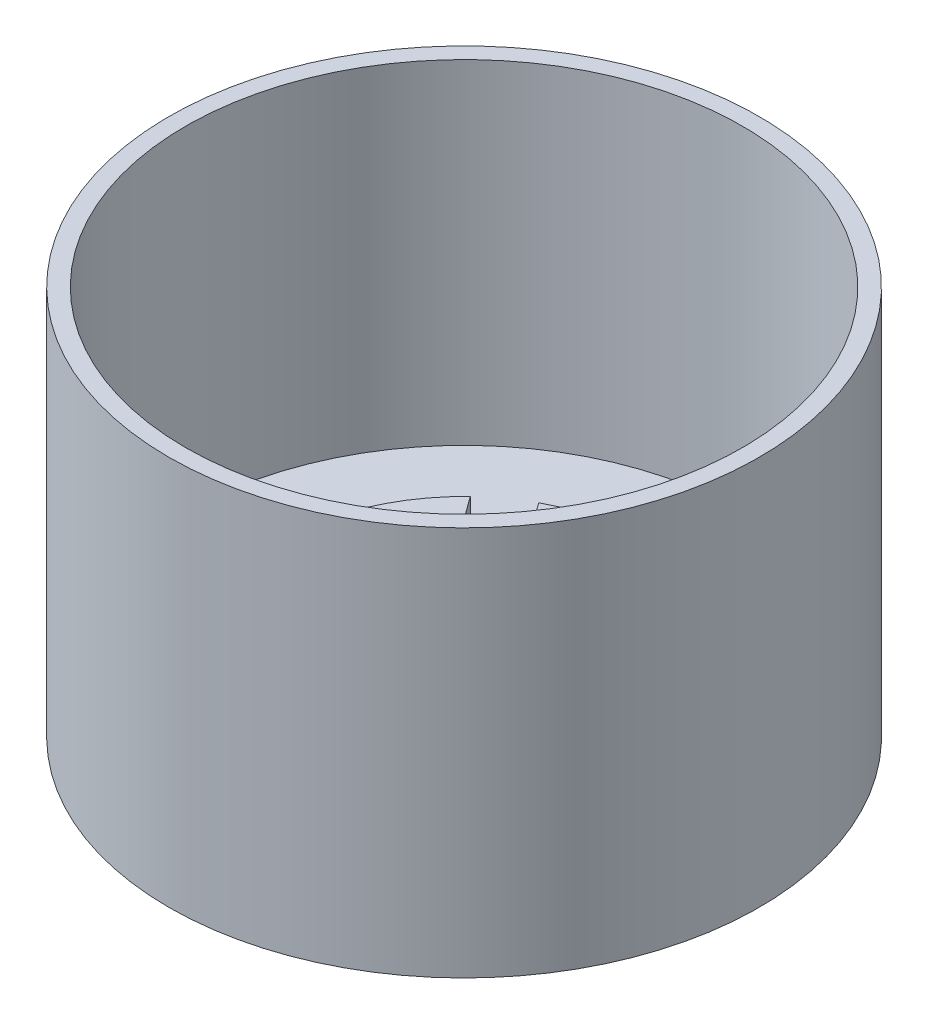
ISO-10303-21;
HEADER;
FILE_DESCRIPTION(('STEP AP214'),'2;1');
FILE_NAME('part.step','',(''),(''),'','','');
FILE_SCHEMA(('AUTOMOTIVE_DESIGN { 1 0 10303 214 1 1 1 1 }'));
ENDSEC;
DATA;
#1=APPLICATION_CONTEXT('core data for automotive mechanical design processes');
#2=APPLICATION_PROTOCOL_DEFINITION('international standard','automotive_design',2000,#1);
#3=PRODUCT_CONTEXT('',#1,'mechanical');
#4=PRODUCT('Part','Part','',(#3));
#5=PRODUCT_RELATED_PRODUCT_CATEGORY('part','',(#4));
#6=PRODUCT_DEFINITION_FORMATION('','',#4);
#7=PRODUCT_DEFINITION_CONTEXT('part definition',#1,'design');
#8=PRODUCT_DEFINITION('design','',#6,#7);
#9=PRODUCT_DEFINITION_SHAPE('','',#8);
#10=(LENGTH_UNIT() NAMED_UNIT(*) SI_UNIT(.MILLI.,.METRE.));
#11=(NAMED_UNIT(*) PLANE_ANGLE_UNIT() SI_UNIT($,.RADIAN.));
#12=(NAMED_UNIT(*) SI_UNIT($,.STERADIAN.) SOLID_ANGLE_UNIT());
#13=UNCERTAINTY_MEASURE_WITH_UNIT(LENGTH_MEASURE(1.E-05),#10,'distance_accuracy_value','');
#14=(GEOMETRIC_REPRESENTATION_CONTEXT(3) GLOBAL_UNCERTAINTY_ASSIGNED_CONTEXT((#13)) GLOBAL_UNIT_ASSIGNED_CONTEXT((#10,
#11,#12)) REPRESENTATION_CONTEXT('',''));
#15=CARTESIAN_POINT('',(0.,0.,0.));
#16=DIRECTION('',(0.,0.,1.));
#17=DIRECTION('',(1.,0.,0.));
#18=AXIS2_PLACEMENT_3D('',#15,#16,#17);
#19=CARTESIAN_POINT('',(0.,5.,0.));
#20=DIRECTION('',(0.,-1.,0.));
#21=DIRECTION('',(0.,0.,-1.));
#22=AXIS2_PLACEMENT_3D('',#19,#20,#21);
#23=CYLINDRICAL_SURFACE('',#22,26.5);
#24=CARTESIAN_POINT('',(0.,0.,0.));
#25=DIRECTION('',(0.,1.,0.));
#26=DIRECTION('',(0.,0.,1.));
#27=AXIS2_PLACEMENT_3D('',#24,#25,#26);
#28=CIRCLE('',#27,26.5);
#29=CARTESIAN_POINT('',(0.,0.,26.5));
#30=VERTEX_POINT('',#29);
#31=EDGE_CURVE('E45',#30,#30,#28,.T.);
#32=ORIENTED_EDGE('',*,*,#31,.T.);
#33=EDGE_LOOP('',(#32));
#34=FACE_BOUND('',#33,.T.);
#35=CARTESIAN_POINT('',(0.,35.,0.));
#36=DIRECTION('',(0.,1.,0.));
#37=DIRECTION('',(0.,0.,1.));
#38=AXIS2_PLACEMENT_3D('',#35,#36,#37);
#39=CIRCLE('',#38,26.5);
#40=CARTESIAN_POINT('',(0.,35.,26.5));
#41=VERTEX_POINT('',#40);
#42=EDGE_CURVE('E339',#41,#41,#39,.T.);
#43=ORIENTED_EDGE('',*,*,#42,.F.);
#44=EDGE_LOOP('',(#43));
#45=FACE_BOUND('',#44,.T.);
#46=ADVANCED_FACE('F37',(#34,#45),#23,.T.);
#47=CARTESIAN_POINT('',(0.,0.,0.));
#48=DIRECTION('',(0.,1.,0.));
#49=DIRECTION('',(0.,0.,1.));
#50=AXIS2_PLACEMENT_3D('',#47,#48,#49);
#51=PLANE('',#50);
#52=CARTESIAN_POINT('',(0.,0.,0.));
#53=DIRECTION('',(0.,-1.,0.));
#54=DIRECTION('',(0.,0.,-1.));
#55=AXIS2_PLACEMENT_3D('',#52,#53,#54);
#56=CIRCLE('',#55,2.1);
#57=CARTESIAN_POINT('',(0.,0.,-2.1));
#58=VERTEX_POINT('',#57);
#59=EDGE_CURVE('E333',#58,#58,#56,.T.);
#60=ORIENTED_EDGE('',*,*,#59,.F.);
#61=EDGE_LOOP('',(#60));
#62=FACE_BOUND('',#61,.T.);
#63=ORIENTED_EDGE('',*,*,#31,.F.);
#64=EDGE_LOOP('',(#63));
#65=FACE_BOUND('',#64,.T.);
#66=ADVANCED_FACE('F347',(#62,#65),#51,.F.);
#67=CARTESIAN_POINT('',(0.,35.,0.));
#68=DIRECTION('',(0.,1.,0.));
#69=DIRECTION('',(0.,0.,1.));
#70=AXIS2_PLACEMENT_3D('',#67,#68,#69);
#71=PLANE('',#70);
#72=ORIENTED_EDGE('',*,*,#42,.T.);
#73=EDGE_LOOP('',(#72));
#74=FACE_BOUND('',#73,.T.);
#75=CARTESIAN_POINT('',(0.,35.,0.));
#76=DIRECTION('',(0.,1.,0.));
#77=DIRECTION('',(0.,0.,1.));
#78=AXIS2_PLACEMENT_3D('',#75,#76,#77);
#79=CIRCLE('',#78,25.);
#80=CARTESIAN_POINT('',(0.,35.,25.));
#81=VERTEX_POINT('',#80);
#82=EDGE_CURVE('E336',#81,#81,#79,.T.);
#83=ORIENTED_EDGE('',*,*,#82,.F.);
#84=EDGE_LOOP('',(#83));
#85=FACE_BOUND('',#84,.T.);
#86=ADVANCED_FACE('F349',(#74,#85),#71,.T.);
#87=CARTESIAN_POINT('',(0.,35.,0.));
#88=DIRECTION('',(0.,-1.,0.));
#89=DIRECTION('',(0.,0.,-1.));
#90=AXIS2_PLACEMENT_3D('',#87,#88,#89);
#91=CYLINDRICAL_SURFACE('',#90,25.);
#92=ORIENTED_EDGE('',*,*,#82,.T.);
#93=EDGE_LOOP('',(#92));
#94=FACE_BOUND('',#93,.T.);
#95=CARTESIAN_POINT('',(0.,5.,0.));
#96=DIRECTION('',(0.,1.,0.));
#97=DIRECTION('',(0.,0.,1.));
#98=AXIS2_PLACEMENT_3D('',#95,#96,#97);
#99=CIRCLE('',#98,25.);
#100=CARTESIAN_POINT('',(0.,5.,25.));
#101=VERTEX_POINT('',#100);
#102=EDGE_CURVE('E11',#101,#101,#99,.F.);
#103=ORIENTED_EDGE('',*,*,#102,.T.);
#104=EDGE_LOOP('',(#103));
#105=FACE_BOUND('',#104,.T.);
#106=ADVANCED_FACE('F355',(#94,#105),#91,.F.);
#107=CARTESIAN_POINT('',(0.,5.,0.));
#108=DIRECTION('',(0.,1.,0.));
#109=DIRECTION('',(0.,0.,1.));
#110=AXIS2_PLACEMENT_3D('',#107,#108,#109);
#111=PLANE('',#110);
#112=CARTESIAN_POINT('',(0.,5.,0.));
#113=DIRECTION('',(0.,1.,0.));
#114=DIRECTION('',(0.,0.,1.));
#115=AXIS2_PLACEMENT_3D('',#112,#113,#114);
#116=CIRCLE('',#115,16.55);
#117=CARTESIAN_POINT('',(-14.9204612481226,5.,7.16116862971903));
#118=VERTEX_POINT('',#117);
#119=CARTESIAN_POINT('',(-2.19999999999999,5.,16.4031247023243));
#120=VERTEX_POINT('',#119);
#121=EDGE_CURVE('E52',#118,#120,#116,.T.);
#122=ORIENTED_EDGE('',*,*,#121,.F.);
#123=DIRECTION('',(-0.951056516295154,0.,0.309016994374948));
#124=VECTOR('',#123,1.);
#125=CARTESIAN_POINT('',(0.679837387624884,5.,2.09232433584934));
#126=LINE('',#125,#124);
#127=CARTESIAN_POINT('',(-12.469529301397,5.,6.36481256610142));
#128=VERTEX_POINT('',#127);
#129=EDGE_CURVE('E195',#128,#118,#126,.T.);
#130=ORIENTED_EDGE('',*,*,#129,.F.);
#131=CARTESIAN_POINT('',(0.,5.,0.));
#132=DIRECTION('',(0.,1.,0.));
#133=DIRECTION('',(0.,0.,1.));
#134=AXIS2_PLACEMENT_3D('',#131,#132,#133);
#135=CIRCLE('',#134,14.);
#136=CARTESIAN_POINT('',(-2.19999999999999,5.,13.8260623461635));
#137=VERTEX_POINT('',#136);
#138=EDGE_CURVE('E192',#128,#137,#135,.T.);
#139=ORIENTED_EDGE('',*,*,#138,.T.);
#140=DIRECTION('',(0.,0.,1.));
#141=VECTOR('',#140,1.);
#142=CARTESIAN_POINT('',(-2.19999999999999,5.,0.));
#143=LINE('',#142,#141);
#144=EDGE_CURVE('E57',#137,#120,#143,.T.);
#145=ORIENTED_EDGE('',*,*,#144,.T.);
#146=EDGE_LOOP('',(#122,#130,#139,#145));
#147=FACE_BOUND('',#146,.T.);
#148=CARTESIAN_POINT('',(0.,5.,0.));
#149=DIRECTION('',(0.,1.,0.));
#150=DIRECTION('',(0.,0.,1.));
#151=AXIS2_PLACEMENT_3D('',#148,#149,#150);
#152=CIRCLE('',#151,16.55);
#153=CARTESIAN_POINT('',(2.2,5.,16.4031247023243));
#154=VERTEX_POINT('',#153);
#155=CARTESIAN_POINT('',(14.9204612481226,5.,7.16116862971902));
#156=VERTEX_POINT('',#155);
#157=EDGE_CURVE('E199',#154,#156,#152,.T.);
#158=ORIENTED_EDGE('',*,*,#157,.F.);
#159=DIRECTION('',(0.,0.,1.));
#160=VECTOR('',#159,1.);
#161=CARTESIAN_POINT('',(2.19999999999995,5.,0.));
#162=LINE('',#161,#160);
#163=CARTESIAN_POINT('',(2.19999999999999,5.,13.8260623461635));
#164=VERTEX_POINT('',#163);
#165=EDGE_CURVE('E196',#164,#154,#162,.T.);
#166=ORIENTED_EDGE('',*,*,#165,.F.);
#167=CARTESIAN_POINT('',(0.,5.,0.));
#168=DIRECTION('',(0.,1.,0.));
#169=DIRECTION('',(0.,0.,1.));
#170=AXIS2_PLACEMENT_3D('',#167,#168,#169);
#171=CIRCLE('',#170,14.);
#172=CARTESIAN_POINT('',(12.469529301397,5.,6.36481256610141));
#173=VERTEX_POINT('',#172);
#174=EDGE_CURVE('E209',#164,#173,#171,.T.);
#175=ORIENTED_EDGE('',*,*,#174,.T.);
#176=DIRECTION('',(0.951056516295155,0.,0.309016994374945));
#177=VECTOR('',#176,1.);
#178=CARTESIAN_POINT('',(-0.679837387624887,5.,2.09232433584936));
#179=LINE('',#178,#177);
#180=EDGE_CURVE('E220',#173,#156,#179,.T.);
#181=ORIENTED_EDGE('',*,*,#180,.T.);
#182=EDGE_LOOP('',(#158,#166,#175,#181));
#183=FACE_BOUND('',#182,.T.);
#184=CARTESIAN_POINT('',(0.,5.,0.));
#185=DIRECTION('',(0.,1.,0.));
#186=DIRECTION('',(0.,0.,1.));
#187=AXIS2_PLACEMENT_3D('',#184,#185,#186);
#188=CIRCLE('',#187,16.55);
#189=CARTESIAN_POINT('',(16.2801360233724,5.,2.97651995802034));
#190=VERTEX_POINT('',#189);
#191=CARTESIAN_POINT('',(11.4213521791654,5.,-11.9772790899884));
#192=VERTEX_POINT('',#191);
#193=EDGE_CURVE('E250',#190,#192,#188,.T.);
#194=ORIENTED_EDGE('',*,*,#193,.F.);
#195=DIRECTION('',(0.951056516295155,0.,0.309016994374944));
#196=VECTOR('',#195,1.);
#197=CARTESIAN_POINT('',(0.679837387624859,5.,-2.09232433584929));
#198=LINE('',#197,#196);
#199=CARTESIAN_POINT('',(13.8292040766467,5.,2.18016389440274));
#200=VERTEX_POINT('',#199);
#201=EDGE_CURVE('E234',#200,#190,#198,.T.);
#202=ORIENTED_EDGE('',*,*,#201,.F.);
#203=CARTESIAN_POINT('',(0.,5.,0.));
#204=DIRECTION('',(0.,1.,0.));
#205=DIRECTION('',(0.,0.,1.));
#206=AXIS2_PLACEMENT_3D('',#203,#204,#205);
#207=CIRCLE('',#206,14.);
#208=CARTESIAN_POINT('',(9.90659293197605,5.,-9.89239184829039));
#209=VERTEX_POINT('',#208);
#210=EDGE_CURVE('E239',#200,#209,#207,.T.);
#211=ORIENTED_EDGE('',*,*,#210,.T.);
#212=DIRECTION('',(0.587785252292471,0.,-0.809016994374949));
#213=VECTOR('',#212,1.);
#214=CARTESIAN_POINT('',(1.77983738762491,5.,1.29312755504345));
#215=LINE('',#214,#213);
#216=EDGE_CURVE('E253',#209,#192,#215,.T.);
#217=ORIENTED_EDGE('',*,*,#216,.T.);
#218=EDGE_LOOP('',(#194,#202,#211,#217));
#219=FACE_BOUND('',#218,.T.);
#220=CARTESIAN_POINT('',(0.,5.,0.));
#221=DIRECTION('',(0.,1.,0.));
#222=DIRECTION('',(0.,0.,1.));
#223=AXIS2_PLACEMENT_3D('',#220,#221,#222);
#224=CIRCLE('',#223,16.55);
#225=CARTESIAN_POINT('',(7.86167740391567,5.,-14.5635342000753));
#226=VERTEX_POINT('',#225);
#227=CARTESIAN_POINT('',(-7.86167740391569,5.,-14.5635342000753));
#228=VERTEX_POINT('',#227);
#229=EDGE_CURVE('E283',#226,#228,#224,.T.);
#230=ORIENTED_EDGE('',*,*,#229,.F.);
#231=DIRECTION('',(0.587785252292471,0.,-0.809016994374949));
#232=VECTOR('',#231,1.);
#233=CARTESIAN_POINT('',(-1.77983738762485,5.,-1.29312755504341));
#234=LINE('',#233,#232);
#235=CARTESIAN_POINT('',(6.34691815672629,5.,-12.4786469583773));
#236=VERTEX_POINT('',#235);
#237=EDGE_CURVE('E267',#236,#226,#234,.T.);
#238=ORIENTED_EDGE('',*,*,#237,.F.);
#239=CARTESIAN_POINT('',(0.,5.,0.));
#240=DIRECTION('',(0.,1.,0.));
#241=DIRECTION('',(0.,0.,1.));
#242=AXIS2_PLACEMENT_3D('',#239,#240,#241);
#243=CIRCLE('',#242,14.);
#244=CARTESIAN_POINT('',(-6.34691815672629,5.,-12.4786469583773));
#245=VERTEX_POINT('',#244);
#246=EDGE_CURVE('E272',#236,#245,#243,.T.);
#247=ORIENTED_EDGE('',*,*,#246,.T.);
#248=DIRECTION('',(-0.587785252292475,0.,-0.809016994374946));
#249=VECTOR('',#248,1.);
#250=CARTESIAN_POINT('',(1.7798373876249,5.,-1.29312755504346));
#251=LINE('',#250,#249);
#252=EDGE_CURVE('E286',#245,#228,#251,.T.);
#253=ORIENTED_EDGE('',*,*,#252,.T.);
#254=EDGE_LOOP('',(#230,#238,#247,#253));
#255=FACE_BOUND('',#254,.T.);
#256=CARTESIAN_POINT('',(0.,5.,0.));
#257=DIRECTION('',(0.,1.,0.));
#258=DIRECTION('',(0.,0.,1.));
#259=AXIS2_PLACEMENT_3D('',#256,#257,#258);
#260=CIRCLE('',#259,16.55);
#261=CARTESIAN_POINT('',(-11.4213521791654,5.,-11.9772790899884));
#262=VERTEX_POINT('',#261);
#263=CARTESIAN_POINT('',(-16.2801360233724,5.,2.97651995802037));
#264=VERTEX_POINT('',#263);
#265=EDGE_CURVE('E316',#262,#264,#260,.T.);
#266=ORIENTED_EDGE('',*,*,#265,.F.);
#267=DIRECTION('',(-0.587785252292475,0.,-0.809016994374947));
#268=VECTOR('',#267,1.);
#269=CARTESIAN_POINT('',(-1.77983738762487,5.,1.29312755504343));
#270=LINE('',#269,#268);
#271=CARTESIAN_POINT('',(-9.90659293197606,5.,-9.89239184829038));
#272=VERTEX_POINT('',#271);
#273=EDGE_CURVE('E300',#272,#262,#270,.T.);
#274=ORIENTED_EDGE('',*,*,#273,.F.);
#275=CARTESIAN_POINT('',(0.,5.,0.));
#276=DIRECTION('',(0.,1.,0.));
#277=DIRECTION('',(0.,0.,1.));
#278=AXIS2_PLACEMENT_3D('',#275,#276,#277);
#279=CIRCLE('',#278,14.);
#280=CARTESIAN_POINT('',(-13.8292040766467,5.,2.18016389440275));
#281=VERTEX_POINT('',#280);
#282=EDGE_CURVE('E305',#272,#281,#279,.T.);
#283=ORIENTED_EDGE('',*,*,#282,.T.);
#284=DIRECTION('',(-0.951056516295153,0.,0.309016994374949));
#285=VECTOR('',#284,1.);
#286=CARTESIAN_POINT('',(-0.679837387624888,5.,-2.09232433584934));
#287=LINE('',#286,#285);
#288=EDGE_CURVE('E319',#281,#264,#287,.T.);
#289=ORIENTED_EDGE('',*,*,#288,.T.);
#290=EDGE_LOOP('',(#266,#274,#283,#289));
#291=FACE_BOUND('',#290,.T.);
#292=CARTESIAN_POINT('',(0.,5.,0.));
#293=DIRECTION('',(0.,1.,0.));
#294=DIRECTION('',(0.,0.,1.));
#295=AXIS2_PLACEMENT_3D('',#292,#293,#294);
#296=CIRCLE('',#295,2.1);
#297=CARTESIAN_POINT('',(0.,5.,2.1));
#298=VERTEX_POINT('',#297);
#299=EDGE_CURVE('E40',#298,#298,#296,.T.);
#300=ORIENTED_EDGE('',*,*,#299,.F.);
#301=EDGE_LOOP('',(#300));
#302=FACE_BOUND('',#301,.T.);
#303=ORIENTED_EDGE('',*,*,#102,.F.);
#304=EDGE_LOOP('',(#303));
#305=FACE_BOUND('',#304,.T.);
#306=ADVANCED_FACE('F360',(#147,#183,#219,#255,#291,#302,#305),#111,.T.);
#307=CARTESIAN_POINT('',(0.,10.,0.));
#308=DIRECTION('',(0.,-1.,0.));
#309=DIRECTION('',(0.,0.,-1.));
#310=AXIS2_PLACEMENT_3D('',#307,#308,#309);
#311=CYLINDRICAL_SURFACE('',#310,2.1);
#312=ORIENTED_EDGE('',*,*,#299,.T.);
#313=EDGE_LOOP('',(#312));
#314=FACE_BOUND('',#313,.T.);
#315=ORIENTED_EDGE('',*,*,#59,.T.);
#316=EDGE_LOOP('',(#315));
#317=FACE_BOUND('',#316,.T.);
#318=ADVANCED_FACE('F362',(#314,#317),#311,.F.);
#319=CARTESIAN_POINT('',(-1.77983738762487,7.,1.29312755504343));
#320=DIRECTION('',(-0.809016994374946,0.,0.587785252292474));
#321=DIRECTION('',(0.587785252292474,0.,0.809016994374946));
#322=AXIS2_PLACEMENT_3D('',#319,#320,#321);
#323=PLANE('',#322);
#324=ORIENTED_EDGE('',*,*,#273,.T.);
#325=DIRECTION('',(0.,-1.,0.));
#326=VECTOR('',#325,1.);
#327=CARTESIAN_POINT('',(-11.4213521791654,7.,-11.9772790899884));
#328=LINE('',#327,#326);
#329=CARTESIAN_POINT('',(-11.4213521791654,7.,-11.9772790899884));
#330=VERTEX_POINT('',#329);
#331=EDGE_CURVE('E330',#330,#262,#328,.T.);
#332=ORIENTED_EDGE('',*,*,#331,.F.);
#333=DIRECTION('',(-0.587785252292475,0.,-0.809016994374947));
#334=VECTOR('',#333,1.);
#335=CARTESIAN_POINT('',(-1.77983738762487,7.,1.29312755504343));
#336=LINE('',#335,#334);
#337=CARTESIAN_POINT('',(-9.90659293197606,7.,-9.89239184829038));
#338=VERTEX_POINT('',#337);
#339=EDGE_CURVE('E301',#338,#330,#336,.T.);
#340=ORIENTED_EDGE('',*,*,#339,.F.);
#341=DIRECTION('',(0.,-1.,0.));
#342=VECTOR('',#341,1.);
#343=CARTESIAN_POINT('',(-9.90659293197606,7.,-9.89239184829038));
#344=LINE('',#343,#342);
#345=EDGE_CURVE('E313',#338,#272,#344,.T.);
#346=ORIENTED_EDGE('',*,*,#345,.T.);
#347=EDGE_LOOP('',(#324,#332,#340,#346));
#348=FACE_BOUND('',#347,.T.);
#349=ADVANCED_FACE('F369',(#348),#323,.F.);
#350=CARTESIAN_POINT('',(0.,7.,0.));
#351=DIRECTION('',(0.,-1.,0.));
#352=DIRECTION('',(0.,0.,-1.));
#353=AXIS2_PLACEMENT_3D('',#350,#351,#352);
#354=CYLINDRICAL_SURFACE('',#353,16.55);
#355=ORIENTED_EDGE('',*,*,#265,.T.);
#356=DIRECTION('',(0.,-1.,0.));
#357=VECTOR('',#356,1.);
#358=CARTESIAN_POINT('',(-16.2801360233724,7.,2.97651995802037));
#359=LINE('',#358,#357);
#360=CARTESIAN_POINT('',(-16.2801360233724,7.,2.97651995802037));
#361=VERTEX_POINT('',#360);
#362=EDGE_CURVE('E327',#361,#264,#359,.T.);
#363=ORIENTED_EDGE('',*,*,#362,.F.);
#364=CARTESIAN_POINT('',(0.,7.,0.));
#365=DIRECTION('',(0.,1.,0.));
#366=DIRECTION('',(0.,0.,1.));
#367=AXIS2_PLACEMENT_3D('',#364,#365,#366);
#368=CIRCLE('',#367,16.55);
#369=EDGE_CURVE('E304',#330,#361,#368,.T.);
#370=ORIENTED_EDGE('',*,*,#369,.F.);
#371=ORIENTED_EDGE('',*,*,#331,.T.);
#372=EDGE_LOOP('',(#355,#363,#370,#371));
#373=FACE_BOUND('',#372,.T.);
#374=ADVANCED_FACE('F373',(#373),#354,.T.);
#375=CARTESIAN_POINT('',(-0.679837387624888,7.,-2.09232433584934));
#376=DIRECTION('',(0.309016994374949,0.,0.951056516295153));
#377=DIRECTION('',(0.951056516295153,0.,-0.309016994374949));
#378=AXIS2_PLACEMENT_3D('',#375,#376,#377);
#379=PLANE('',#378);
#380=ORIENTED_EDGE('',*,*,#288,.F.);
#381=DIRECTION('',(0.,-1.,0.));
#382=VECTOR('',#381,1.);
#383=CARTESIAN_POINT('',(-13.8292040766467,7.,2.18016389440275));
#384=LINE('',#383,#382);
#385=CARTESIAN_POINT('',(-13.8292040766467,7.,2.18016389440275));
#386=VERTEX_POINT('',#385);
#387=EDGE_CURVE('E324',#386,#281,#384,.T.);
#388=ORIENTED_EDGE('',*,*,#387,.F.);
#389=DIRECTION('',(-0.951056516295153,0.,0.309016994374949));
#390=VECTOR('',#389,1.);
#391=CARTESIAN_POINT('',(-0.679837387624888,7.,-2.09232433584934));
#392=LINE('',#391,#390);
#393=EDGE_CURVE('E307',#386,#361,#392,.T.);
#394=ORIENTED_EDGE('',*,*,#393,.T.);
#395=ORIENTED_EDGE('',*,*,#362,.T.);
#396=EDGE_LOOP('',(#380,#388,#394,#395));
#397=FACE_BOUND('',#396,.T.);
#398=ADVANCED_FACE('F377',(#397),#379,.T.);
#399=CARTESIAN_POINT('',(0.,7.,0.));
#400=DIRECTION('',(0.,-1.,0.));
#401=DIRECTION('',(0.,0.,-1.));
#402=AXIS2_PLACEMENT_3D('',#399,#400,#401);
#403=CYLINDRICAL_SURFACE('',#402,14.);
#404=ORIENTED_EDGE('',*,*,#282,.F.);
#405=ORIENTED_EDGE('',*,*,#345,.F.);
#406=CARTESIAN_POINT('',(0.,7.,0.));
#407=DIRECTION('',(0.,1.,0.));
#408=DIRECTION('',(0.,0.,1.));
#409=AXIS2_PLACEMENT_3D('',#406,#407,#408);
#410=CIRCLE('',#409,14.);
#411=EDGE_CURVE('E310',#338,#386,#410,.T.);
#412=ORIENTED_EDGE('',*,*,#411,.T.);
#413=ORIENTED_EDGE('',*,*,#387,.T.);
#414=EDGE_LOOP('',(#404,#405,#412,#413));
#415=FACE_BOUND('',#414,.T.);
#416=ADVANCED_FACE('F381',(#415),#403,.F.);
#417=CARTESIAN_POINT('',(0.,7.,0.));
#418=DIRECTION('',(0.,1.,0.));
#419=DIRECTION('',(0.,0.,1.));
#420=AXIS2_PLACEMENT_3D('',#417,#418,#419);
#421=PLANE('',#420);
#422=ORIENTED_EDGE('',*,*,#339,.T.);
#423=ORIENTED_EDGE('',*,*,#369,.T.);
#424=ORIENTED_EDGE('',*,*,#393,.F.);
#425=ORIENTED_EDGE('',*,*,#411,.F.);
#426=EDGE_LOOP('',(#422,#423,#424,#425));
#427=FACE_BOUND('',#426,.T.);
#428=ADVANCED_FACE('F385',(#427),#421,.T.);
#429=CARTESIAN_POINT('',(-1.77983738762485,7.,-1.29312755504341));
#430=DIRECTION('',(-0.809016994374949,0.,-0.587785252292471));
#431=DIRECTION('',(-0.587785252292471,0.,0.809016994374949));
#432=AXIS2_PLACEMENT_3D('',#429,#430,#431);
#433=PLANE('',#432);
#434=ORIENTED_EDGE('',*,*,#237,.T.);
#435=DIRECTION('',(0.,-1.,0.));
#436=VECTOR('',#435,1.);
#437=CARTESIAN_POINT('',(7.86167740391567,7.,-14.5635342000753));
#438=LINE('',#437,#436);
#439=CARTESIAN_POINT('',(7.86167740391567,7.,-14.5635342000753));
#440=VERTEX_POINT('',#439);
#441=EDGE_CURVE('E297',#440,#226,#438,.T.);
#442=ORIENTED_EDGE('',*,*,#441,.F.);
#443=DIRECTION('',(0.587785252292471,0.,-0.809016994374949));
#444=VECTOR('',#443,1.);
#445=CARTESIAN_POINT('',(-1.77983738762485,7.,-1.29312755504341));
#446=LINE('',#445,#444);
#447=CARTESIAN_POINT('',(6.34691815672629,7.,-12.4786469583773));
#448=VERTEX_POINT('',#447);
#449=EDGE_CURVE('E268',#448,#440,#446,.T.);
#450=ORIENTED_EDGE('',*,*,#449,.F.);
#451=DIRECTION('',(0.,-1.,0.));
#452=VECTOR('',#451,1.);
#453=CARTESIAN_POINT('',(6.34691815672629,7.,-12.4786469583773));
#454=LINE('',#453,#452);
#455=EDGE_CURVE('E280',#448,#236,#454,.T.);
#456=ORIENTED_EDGE('',*,*,#455,.T.);
#457=EDGE_LOOP('',(#434,#442,#450,#456));
#458=FACE_BOUND('',#457,.T.);
#459=ADVANCED_FACE('F389',(#458),#433,.F.);
#460=CARTESIAN_POINT('',(0.,7.,0.));
#461=DIRECTION('',(0.,-1.,0.));
#462=DIRECTION('',(0.,0.,-1.));
#463=AXIS2_PLACEMENT_3D('',#460,#461,#462);
#464=CYLINDRICAL_SURFACE('',#463,16.55);
#465=ORIENTED_EDGE('',*,*,#229,.T.);
#466=DIRECTION('',(0.,-1.,0.));
#467=VECTOR('',#466,1.);
#468=CARTESIAN_POINT('',(-7.86167740391569,7.,-14.5635342000753));
#469=LINE('',#468,#467);
#470=CARTESIAN_POINT('',(-7.86167740391569,7.,-14.5635342000753));
#471=VERTEX_POINT('',#470);
#472=EDGE_CURVE('E294',#471,#228,#469,.T.);
#473=ORIENTED_EDGE('',*,*,#472,.F.);
#474=CARTESIAN_POINT('',(0.,7.,0.));
#475=DIRECTION('',(0.,1.,0.));
#476=DIRECTION('',(0.,0.,1.));
#477=AXIS2_PLACEMENT_3D('',#474,#475,#476);
#478=CIRCLE('',#477,16.55);
#479=EDGE_CURVE('E271',#440,#471,#478,.T.);
#480=ORIENTED_EDGE('',*,*,#479,.F.);
#481=ORIENTED_EDGE('',*,*,#441,.T.);
#482=EDGE_LOOP('',(#465,#473,#480,#481));
#483=FACE_BOUND('',#482,.T.);
#484=ADVANCED_FACE('F393',(#483),#464,.T.);
#485=CARTESIAN_POINT('',(1.7798373876249,7.,-1.29312755504346));
#486=DIRECTION('',(-0.809016994374946,0.,0.587785252292475));
#487=DIRECTION('',(0.587785252292475,0.,0.809016994374946));
#488=AXIS2_PLACEMENT_3D('',#485,#486,#487);
#489=PLANE('',#488);
#490=ORIENTED_EDGE('',*,*,#252,.F.);
#491=DIRECTION('',(0.,-1.,0.));
#492=VECTOR('',#491,1.);
#493=CARTESIAN_POINT('',(-6.3469181567263,7.,-12.4786469583773));
#494=LINE('',#493,#492);
#495=CARTESIAN_POINT('',(-6.3469181567263,7.,-12.4786469583773));
#496=VERTEX_POINT('',#495);
#497=EDGE_CURVE('E291',#496,#245,#494,.T.);
#498=ORIENTED_EDGE('',*,*,#497,.F.);
#499=DIRECTION('',(-0.587785252292475,0.,-0.809016994374946));
#500=VECTOR('',#499,1.);
#501=CARTESIAN_POINT('',(1.7798373876249,7.,-1.29312755504346));
#502=LINE('',#501,#500);
#503=EDGE_CURVE('E274',#496,#471,#502,.T.);
#504=ORIENTED_EDGE('',*,*,#503,.T.);
#505=ORIENTED_EDGE('',*,*,#472,.T.);
#506=EDGE_LOOP('',(#490,#498,#504,#505));
#507=FACE_BOUND('',#506,.T.);
#508=ADVANCED_FACE('F397',(#507),#489,.T.);
#509=CARTESIAN_POINT('',(0.,7.,0.));
#510=DIRECTION('',(0.,-1.,0.));
#511=DIRECTION('',(0.,0.,-1.));
#512=AXIS2_PLACEMENT_3D('',#509,#510,#511);
#513=CYLINDRICAL_SURFACE('',#512,14.);
#514=ORIENTED_EDGE('',*,*,#246,.F.);
#515=ORIENTED_EDGE('',*,*,#455,.F.);
#516=CARTESIAN_POINT('',(0.,7.,0.));
#517=DIRECTION('',(0.,1.,0.));
#518=DIRECTION('',(0.,0.,1.));
#519=AXIS2_PLACEMENT_3D('',#516,#517,#518);
#520=CIRCLE('',#519,14.);
#521=EDGE_CURVE('E277',#448,#496,#520,.T.);
#522=ORIENTED_EDGE('',*,*,#521,.T.);
#523=ORIENTED_EDGE('',*,*,#497,.T.);
#524=EDGE_LOOP('',(#514,#515,#522,#523));
#525=FACE_BOUND('',#524,.T.);
#526=ADVANCED_FACE('F401',(#525),#513,.F.);
#527=CARTESIAN_POINT('',(0.,7.,0.));
#528=DIRECTION('',(0.,1.,0.));
#529=DIRECTION('',(0.,0.,1.));
#530=AXIS2_PLACEMENT_3D('',#527,#528,#529);
#531=PLANE('',#530);
#532=ORIENTED_EDGE('',*,*,#449,.T.);
#533=ORIENTED_EDGE('',*,*,#479,.T.);
#534=ORIENTED_EDGE('',*,*,#503,.F.);
#535=ORIENTED_EDGE('',*,*,#521,.F.);
#536=EDGE_LOOP('',(#532,#533,#534,#535));
#537=FACE_BOUND('',#536,.T.);
#538=ADVANCED_FACE('F405',(#537),#531,.T.);
#539=CARTESIAN_POINT('',(0.679837387624859,7.,-2.09232433584929));
#540=DIRECTION('',(0.309016994374944,0.,-0.951056516295155));
#541=DIRECTION('',(-0.951056516295155,0.,-0.309016994374944));
#542=AXIS2_PLACEMENT_3D('',#539,#540,#541);
#543=PLANE('',#542);
#544=ORIENTED_EDGE('',*,*,#201,.T.);
#545=DIRECTION('',(0.,-1.,0.));
#546=VECTOR('',#545,1.);
#547=CARTESIAN_POINT('',(16.2801360233724,7.,2.97651995802034));
#548=LINE('',#547,#546);
#549=CARTESIAN_POINT('',(16.2801360233724,7.,2.97651995802034));
#550=VERTEX_POINT('',#549);
#551=EDGE_CURVE('E264',#550,#190,#548,.T.);
#552=ORIENTED_EDGE('',*,*,#551,.F.);
#553=DIRECTION('',(0.951056516295155,0.,0.309016994374944));
#554=VECTOR('',#553,1.);
#555=CARTESIAN_POINT('',(0.679837387624859,7.,-2.09232433584929));
#556=LINE('',#555,#554);
#557=CARTESIAN_POINT('',(13.8292040766467,7.,2.18016389440274));
#558=VERTEX_POINT('',#557);
#559=EDGE_CURVE('E235',#558,#550,#556,.T.);
#560=ORIENTED_EDGE('',*,*,#559,.F.);
#561=DIRECTION('',(0.,-1.,0.));
#562=VECTOR('',#561,1.);
#563=CARTESIAN_POINT('',(13.8292040766467,7.,2.18016389440274));
#564=LINE('',#563,#562);
#565=EDGE_CURVE('E247',#558,#200,#564,.T.);
#566=ORIENTED_EDGE('',*,*,#565,.T.);
#567=EDGE_LOOP('',(#544,#552,#560,#566));
#568=FACE_BOUND('',#567,.T.);
#569=ADVANCED_FACE('F409',(#568),#543,.F.);
#570=CARTESIAN_POINT('',(0.,7.,0.));
#571=DIRECTION('',(0.,-1.,0.));
#572=DIRECTION('',(0.,0.,-1.));
#573=AXIS2_PLACEMENT_3D('',#570,#571,#572);
#574=CYLINDRICAL_SURFACE('',#573,16.55);
#575=ORIENTED_EDGE('',*,*,#193,.T.);
#576=DIRECTION('',(0.,-1.,0.));
#577=VECTOR('',#576,1.);
#578=CARTESIAN_POINT('',(11.4213521791654,7.,-11.9772790899884));
#579=LINE('',#578,#577);
#580=CARTESIAN_POINT('',(11.4213521791654,7.,-11.9772790899884));
#581=VERTEX_POINT('',#580);
#582=EDGE_CURVE('E261',#581,#192,#579,.T.);
#583=ORIENTED_EDGE('',*,*,#582,.F.);
#584=CARTESIAN_POINT('',(0.,7.,0.));
#585=DIRECTION('',(0.,1.,0.));
#586=DIRECTION('',(0.,0.,1.));
#587=AXIS2_PLACEMENT_3D('',#584,#585,#586);
#588=CIRCLE('',#587,16.55);
#589=EDGE_CURVE('E238',#550,#581,#588,.T.);
#590=ORIENTED_EDGE('',*,*,#589,.F.);
#591=ORIENTED_EDGE('',*,*,#551,.T.);
#592=EDGE_LOOP('',(#575,#583,#590,#591));
#593=FACE_BOUND('',#592,.T.);
#594=ADVANCED_FACE('F413',(#593),#574,.T.);
#595=CARTESIAN_POINT('',(1.77983738762491,7.,1.29312755504345));
#596=DIRECTION('',(-0.809016994374949,0.,-0.587785252292471));
#597=DIRECTION('',(-0.587785252292471,0.,0.809016994374949));
#598=AXIS2_PLACEMENT_3D('',#595,#596,#597);
#599=PLANE('',#598);
#600=ORIENTED_EDGE('',*,*,#216,.F.);
#601=DIRECTION('',(0.,-1.,0.));
#602=VECTOR('',#601,1.);
#603=CARTESIAN_POINT('',(9.90659293197605,7.,-9.89239184829039));
#604=LINE('',#603,#602);
#605=CARTESIAN_POINT('',(9.90659293197605,7.,-9.89239184829039));
#606=VERTEX_POINT('',#605);
#607=EDGE_CURVE('E258',#606,#209,#604,.T.);
#608=ORIENTED_EDGE('',*,*,#607,.F.);
#609=DIRECTION('',(0.587785252292471,0.,-0.809016994374949));
#610=VECTOR('',#609,1.);
#611=CARTESIAN_POINT('',(1.77983738762491,7.,1.29312755504345));
#612=LINE('',#611,#610);
#613=EDGE_CURVE('E241',#606,#581,#612,.T.);
#614=ORIENTED_EDGE('',*,*,#613,.T.);
#615=ORIENTED_EDGE('',*,*,#582,.T.);
#616=EDGE_LOOP('',(#600,#608,#614,#615));
#617=FACE_BOUND('',#616,.T.);
#618=ADVANCED_FACE('F417',(#617),#599,.T.);
#619=CARTESIAN_POINT('',(0.,7.,0.));
#620=DIRECTION('',(0.,-1.,0.));
#621=DIRECTION('',(0.,0.,-1.));
#622=AXIS2_PLACEMENT_3D('',#619,#620,#621);
#623=CYLINDRICAL_SURFACE('',#622,14.);
#624=ORIENTED_EDGE('',*,*,#210,.F.);
#625=ORIENTED_EDGE('',*,*,#565,.F.);
#626=CARTESIAN_POINT('',(0.,7.,0.));
#627=DIRECTION('',(0.,1.,0.));
#628=DIRECTION('',(0.,0.,1.));
#629=AXIS2_PLACEMENT_3D('',#626,#627,#628);
#630=CIRCLE('',#629,14.);
#631=EDGE_CURVE('E244',#558,#606,#630,.T.);
#632=ORIENTED_EDGE('',*,*,#631,.T.);
#633=ORIENTED_EDGE('',*,*,#607,.T.);
#634=EDGE_LOOP('',(#624,#625,#632,#633));
#635=FACE_BOUND('',#634,.T.);
#636=ADVANCED_FACE('F421',(#635),#623,.F.);
#637=CARTESIAN_POINT('',(0.,7.,0.));
#638=DIRECTION('',(0.,1.,0.));
#639=DIRECTION('',(0.,0.,1.));
#640=AXIS2_PLACEMENT_3D('',#637,#638,#639);
#641=PLANE('',#640);
#642=ORIENTED_EDGE('',*,*,#559,.T.);
#643=ORIENTED_EDGE('',*,*,#589,.T.);
#644=ORIENTED_EDGE('',*,*,#613,.F.);
#645=ORIENTED_EDGE('',*,*,#631,.F.);
#646=EDGE_LOOP('',(#642,#643,#644,#645));
#647=FACE_BOUND('',#646,.T.);
#648=ADVANCED_FACE('F425',(#647),#641,.T.);
#649=CARTESIAN_POINT('',(2.19999999999995,7.,0.));
#650=DIRECTION('',(1.,0.,0.));
#651=DIRECTION('',(0.,0.,-1.));
#652=AXIS2_PLACEMENT_3D('',#649,#650,#651);
#653=PLANE('',#652);
#654=ORIENTED_EDGE('',*,*,#165,.T.);
#655=DIRECTION('',(0.,-1.,0.));
#656=VECTOR('',#655,1.);
#657=CARTESIAN_POINT('',(2.2,7.,16.4031247023243));
#658=LINE('',#657,#656);
#659=CARTESIAN_POINT('',(2.2,7.,16.4031247023243));
#660=VERTEX_POINT('',#659);
#661=EDGE_CURVE('E231',#660,#154,#658,.T.);
#662=ORIENTED_EDGE('',*,*,#661,.F.);
#663=DIRECTION('',(0.,0.,1.));
#664=VECTOR('',#663,1.);
#665=CARTESIAN_POINT('',(2.19999999999995,7.,0.));
#666=LINE('',#665,#664);
#667=CARTESIAN_POINT('',(2.19999999999999,7.,13.8260623461635));
#668=VERTEX_POINT('',#667);
#669=EDGE_CURVE('E205',#668,#660,#666,.T.);
#670=ORIENTED_EDGE('',*,*,#669,.F.);
#671=DIRECTION('',(0.,-1.,0.));
#672=VECTOR('',#671,1.);
#673=CARTESIAN_POINT('',(2.19999999999999,7.,13.8260623461635));
#674=LINE('',#673,#672);
#675=EDGE_CURVE('E216',#668,#164,#674,.T.);
#676=ORIENTED_EDGE('',*,*,#675,.T.);
#677=EDGE_LOOP('',(#654,#662,#670,#676));
#678=FACE_BOUND('',#677,.T.);
#679=ADVANCED_FACE('F429',(#678),#653,.F.);
#680=CARTESIAN_POINT('',(0.,7.,0.));
#681=DIRECTION('',(0.,-1.,0.));
#682=DIRECTION('',(0.,0.,-1.));
#683=AXIS2_PLACEMENT_3D('',#680,#681,#682);
#684=CYLINDRICAL_SURFACE('',#683,16.55);
#685=ORIENTED_EDGE('',*,*,#157,.T.);
#686=DIRECTION('',(0.,-1.,0.));
#687=VECTOR('',#686,1.);
#688=CARTESIAN_POINT('',(14.9204612481226,7.,7.16116862971902));
#689=LINE('',#688,#687);
#690=CARTESIAN_POINT('',(14.9204612481226,7.,7.16116862971902));
#691=VERTEX_POINT('',#690);
#692=EDGE_CURVE('E228',#691,#156,#689,.T.);
#693=ORIENTED_EDGE('',*,*,#692,.F.);
#694=CARTESIAN_POINT('',(0.,7.,0.));
#695=DIRECTION('',(0.,1.,0.));
#696=DIRECTION('',(0.,0.,1.));
#697=AXIS2_PLACEMENT_3D('',#694,#695,#696);
#698=CIRCLE('',#697,16.55);
#699=EDGE_CURVE('E208',#660,#691,#698,.T.);
#700=ORIENTED_EDGE('',*,*,#699,.F.);
#701=ORIENTED_EDGE('',*,*,#661,.T.);
#702=EDGE_LOOP('',(#685,#693,#700,#701));
#703=FACE_BOUND('',#702,.T.);
#704=ADVANCED_FACE('F433',(#703),#684,.T.);
#705=CARTESIAN_POINT('',(-0.679837387624887,7.,2.09232433584936));
#706=DIRECTION('',(0.309016994374945,0.,-0.951056516295154));
#707=DIRECTION('',(-0.951056516295155,0.,-0.309016994374945));
#708=AXIS2_PLACEMENT_3D('',#705,#706,#707);
#709=PLANE('',#708);
#710=ORIENTED_EDGE('',*,*,#180,.F.);
#711=DIRECTION('',(0.,-1.,0.));
#712=VECTOR('',#711,1.);
#713=CARTESIAN_POINT('',(12.469529301397,7.,6.36481256610141));
#714=LINE('',#713,#712);
#715=CARTESIAN_POINT('',(12.469529301397,7.,6.36481256610141));
#716=VERTEX_POINT('',#715);
#717=EDGE_CURVE('E225',#716,#173,#714,.T.);
#718=ORIENTED_EDGE('',*,*,#717,.F.);
#719=DIRECTION('',(0.951056516295155,0.,0.309016994374945));
#720=VECTOR('',#719,1.);
#721=CARTESIAN_POINT('',(-0.679837387624887,7.,2.09232433584936));
#722=LINE('',#721,#720);
#723=EDGE_CURVE('E211',#716,#691,#722,.T.);
#724=ORIENTED_EDGE('',*,*,#723,.T.);
#725=ORIENTED_EDGE('',*,*,#692,.T.);
#726=EDGE_LOOP('',(#710,#718,#724,#725));
#727=FACE_BOUND('',#726,.T.);
#728=ADVANCED_FACE('F437',(#727),#709,.T.);
#729=CARTESIAN_POINT('',(0.,7.,0.));
#730=DIRECTION('',(0.,-1.,0.));
#731=DIRECTION('',(0.,0.,-1.));
#732=AXIS2_PLACEMENT_3D('',#729,#730,#731);
#733=CYLINDRICAL_SURFACE('',#732,14.);
#734=ORIENTED_EDGE('',*,*,#174,.F.);
#735=ORIENTED_EDGE('',*,*,#675,.F.);
#736=CARTESIAN_POINT('',(0.,7.,0.));
#737=DIRECTION('',(0.,1.,0.));
#738=DIRECTION('',(0.,0.,1.));
#739=AXIS2_PLACEMENT_3D('',#736,#737,#738);
#740=CIRCLE('',#739,14.);
#741=EDGE_CURVE('E214',#668,#716,#740,.T.);
#742=ORIENTED_EDGE('',*,*,#741,.T.);
#743=ORIENTED_EDGE('',*,*,#717,.T.);
#744=EDGE_LOOP('',(#734,#735,#742,#743));
#745=FACE_BOUND('',#744,.T.);
#746=ADVANCED_FACE('F441',(#745),#733,.F.);
#747=CARTESIAN_POINT('',(0.,7.,0.));
#748=DIRECTION('',(0.,1.,0.));
#749=DIRECTION('',(0.,0.,1.));
#750=AXIS2_PLACEMENT_3D('',#747,#748,#749);
#751=PLANE('',#750);
#752=ORIENTED_EDGE('',*,*,#669,.T.);
#753=ORIENTED_EDGE('',*,*,#699,.T.);
#754=ORIENTED_EDGE('',*,*,#723,.F.);
#755=ORIENTED_EDGE('',*,*,#741,.F.);
#756=EDGE_LOOP('',(#752,#753,#754,#755));
#757=FACE_BOUND('',#756,.T.);
#758=ADVANCED_FACE('F445',(#757),#751,.T.);
#759=CARTESIAN_POINT('',(0.679837387624884,7.,2.09232433584934));
#760=DIRECTION('',(0.309016994374948,0.,0.951056516295154));
#761=DIRECTION('',(0.951056516295154,0.,-0.309016994374948));
#762=AXIS2_PLACEMENT_3D('',#759,#760,#761);
#763=PLANE('',#762);
#764=ORIENTED_EDGE('',*,*,#129,.T.);
#765=DIRECTION('',(0.,-1.,0.));
#766=VECTOR('',#765,1.);
#767=CARTESIAN_POINT('',(-14.9204612481226,7.,7.16116862971903));
#768=LINE('',#767,#766);
#769=CARTESIAN_POINT('',(-14.9204612481226,7.,7.16116862971903));
#770=VERTEX_POINT('',#769);
#771=EDGE_CURVE('E176',#770,#118,#768,.T.);
#772=ORIENTED_EDGE('',*,*,#771,.F.);
#773=DIRECTION('',(-0.951056516295154,0.,0.309016994374948));
#774=VECTOR('',#773,1.);
#775=CARTESIAN_POINT('',(0.679837387624884,7.,2.09232433584934));
#776=LINE('',#775,#774);
#777=CARTESIAN_POINT('',(-12.469529301397,7.,6.36481256610142));
#778=VERTEX_POINT('',#777);
#779=EDGE_CURVE('E183',#778,#770,#776,.T.);
#780=ORIENTED_EDGE('',*,*,#779,.F.);
#781=DIRECTION('',(0.,-1.,0.));
#782=VECTOR('',#781,1.);
#783=CARTESIAN_POINT('',(-12.469529301397,7.,6.36481256610142));
#784=LINE('',#783,#782);
#785=EDGE_CURVE('E652',#778,#128,#784,.T.);
#786=ORIENTED_EDGE('',*,*,#785,.T.);
#787=EDGE_LOOP('',(#764,#772,#780,#786));
#788=FACE_BOUND('',#787,.T.);
#789=ADVANCED_FACE('F194',(#788),#763,.F.);
#790=CARTESIAN_POINT('',(0.,7.,0.));
#791=DIRECTION('',(0.,-1.,0.));
#792=DIRECTION('',(0.,0.,-1.));
#793=AXIS2_PLACEMENT_3D('',#790,#791,#792);
#794=CYLINDRICAL_SURFACE('',#793,16.55);
#795=ORIENTED_EDGE('',*,*,#121,.T.);
#796=DIRECTION('',(0.,-1.,0.));
#797=VECTOR('',#796,1.);
#798=CARTESIAN_POINT('',(-2.19999999999999,7.,16.4031247023243));
#799=LINE('',#798,#797);
#800=CARTESIAN_POINT('',(-2.19999999999999,7.,16.4031247023243));
#801=VERTEX_POINT('',#800);
#802=EDGE_CURVE('E178',#801,#120,#799,.T.);
#803=ORIENTED_EDGE('',*,*,#802,.F.);
#804=CARTESIAN_POINT('',(0.,7.,0.));
#805=DIRECTION('',(0.,1.,0.));
#806=DIRECTION('',(0.,0.,1.));
#807=AXIS2_PLACEMENT_3D('',#804,#805,#806);
#808=CIRCLE('',#807,16.55);
#809=EDGE_CURVE('E172',#770,#801,#808,.T.);
#810=ORIENTED_EDGE('',*,*,#809,.F.);
#811=ORIENTED_EDGE('',*,*,#771,.T.);
#812=EDGE_LOOP('',(#795,#803,#810,#811));
#813=FACE_BOUND('',#812,.T.);
#814=ADVANCED_FACE('F174',(#813),#794,.T.);
#815=CARTESIAN_POINT('',(-2.19999999999999,7.,0.));
#816=DIRECTION('',(1.,0.,0.));
#817=DIRECTION('',(0.,0.,-1.));
#818=AXIS2_PLACEMENT_3D('',#815,#816,#817);
#819=PLANE('',#818);
#820=ORIENTED_EDGE('',*,*,#144,.F.);
#821=DIRECTION('',(0.,-1.,0.));
#822=VECTOR('',#821,1.);
#823=CARTESIAN_POINT('',(-2.19999999999999,7.,13.8260623461635));
#824=LINE('',#823,#822);
#825=CARTESIAN_POINT('',(-2.19999999999999,7.,13.8260623461635));
#826=VERTEX_POINT('',#825);
#827=EDGE_CURVE('E201',#826,#137,#824,.T.);
#828=ORIENTED_EDGE('',*,*,#827,.F.);
#829=DIRECTION('',(0.,0.,1.));
#830=VECTOR('',#829,1.);
#831=CARTESIAN_POINT('',(-2.19999999999999,7.,0.));
#832=LINE('',#831,#830);
#833=EDGE_CURVE('E182',#826,#801,#832,.T.);
#834=ORIENTED_EDGE('',*,*,#833,.T.);
#835=ORIENTED_EDGE('',*,*,#802,.T.);
#836=EDGE_LOOP('',(#820,#828,#834,#835));
#837=FACE_BOUND('',#836,.T.);
#838=ADVANCED_FACE('F454',(#837),#819,.T.);
#839=CARTESIAN_POINT('',(0.,7.,0.));
#840=DIRECTION('',(0.,-1.,0.));
#841=DIRECTION('',(0.,0.,-1.));
#842=AXIS2_PLACEMENT_3D('',#839,#840,#841);
#843=CYLINDRICAL_SURFACE('',#842,14.);
#844=ORIENTED_EDGE('',*,*,#138,.F.);
#845=ORIENTED_EDGE('',*,*,#785,.F.);
#846=CARTESIAN_POINT('',(0.,7.,0.));
#847=DIRECTION('',(0.,1.,0.));
#848=DIRECTION('',(0.,0.,1.));
#849=AXIS2_PLACEMENT_3D('',#846,#847,#848);
#850=CIRCLE('',#849,14.);
#851=EDGE_CURVE('E189',#778,#826,#850,.T.);
#852=ORIENTED_EDGE('',*,*,#851,.T.);
#853=ORIENTED_EDGE('',*,*,#827,.T.);
#854=EDGE_LOOP('',(#844,#845,#852,#853));
#855=FACE_BOUND('',#854,.T.);
#856=ADVANCED_FACE('F457',(#855),#843,.F.);
#857=CARTESIAN_POINT('',(0.,7.,0.));
#858=DIRECTION('',(0.,1.,0.));
#859=DIRECTION('',(0.,0.,1.));
#860=AXIS2_PLACEMENT_3D('',#857,#858,#859);
#861=PLANE('',#860);
#862=ORIENTED_EDGE('',*,*,#779,.T.);
#863=ORIENTED_EDGE('',*,*,#809,.T.);
#864=ORIENTED_EDGE('',*,*,#833,.F.);
#865=ORIENTED_EDGE('',*,*,#851,.F.);
#866=EDGE_LOOP('',(#862,#863,#864,#865));
#867=FACE_BOUND('',#866,.T.);
#868=ADVANCED_FACE('F187',(#867),#861,.T.);
#869=CLOSED_SHELL('',(#46,#66,#86,#106,#306,#318,#349,#374,#398,#416,#428,#459,#484,#508,#526,
#538,#569,#594,#618,#636,#648,#679,#704,#728,#746,#758,#789,#814,#838,#856,#868));
#870=MANIFOLD_SOLID_BREP('B2',#869);
#871=ADVANCED_BREP_SHAPE_REPRESENTATION('',(#18,#870),#14);
#872=SHAPE_DEFINITION_REPRESENTATION(#9,#871);
ENDSEC;
END-ISO-10303-21;
